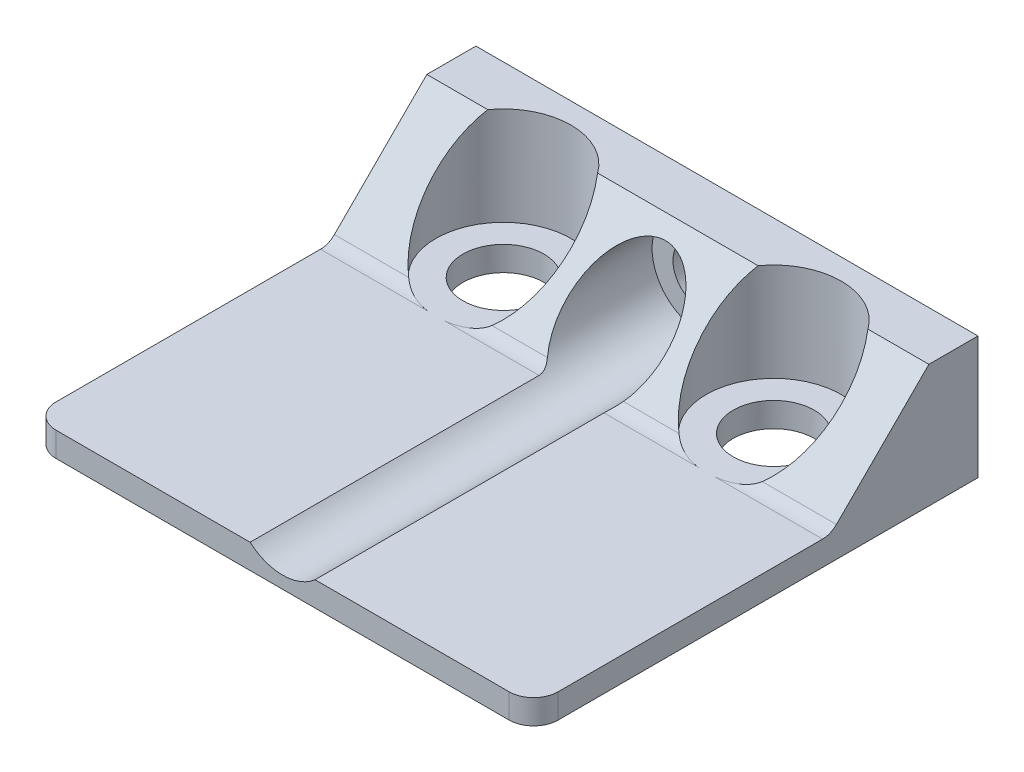
ISO-10303-21;
HEADER;
FILE_DESCRIPTION(('STEP AP214'),'2;1');
FILE_NAME('part.step','',(''),(''),'','','');
FILE_SCHEMA(('AUTOMOTIVE_DESIGN { 1 0 10303 214 1 1 1 1 }'));
ENDSEC;
DATA;
#1=APPLICATION_CONTEXT('core data for automotive mechanical design processes');
#2=APPLICATION_PROTOCOL_DEFINITION('international standard','automotive_design',2000,#1);
#3=PRODUCT_CONTEXT('',#1,'mechanical');
#4=PRODUCT('Part','Part','',(#3));
#5=PRODUCT_RELATED_PRODUCT_CATEGORY('part','',(#4));
#6=PRODUCT_DEFINITION_FORMATION('','',#4);
#7=PRODUCT_DEFINITION_CONTEXT('part definition',#1,'design');
#8=PRODUCT_DEFINITION('design','',#6,#7);
#9=PRODUCT_DEFINITION_SHAPE('','',#8);
#10=(LENGTH_UNIT() NAMED_UNIT(*) SI_UNIT(.MILLI.,.METRE.));
#11=(NAMED_UNIT(*) PLANE_ANGLE_UNIT() SI_UNIT($,.RADIAN.));
#12=(NAMED_UNIT(*) SI_UNIT($,.STERADIAN.) SOLID_ANGLE_UNIT());
#13=UNCERTAINTY_MEASURE_WITH_UNIT(LENGTH_MEASURE(1.E-05),#10,'distance_accuracy_value','');
#14=(GEOMETRIC_REPRESENTATION_CONTEXT(3) GLOBAL_UNCERTAINTY_ASSIGNED_CONTEXT((#13)) GLOBAL_UNIT_ASSIGNED_CONTEXT((#10,
#11,#12)) REPRESENTATION_CONTEXT('',''));
#15=CARTESIAN_POINT('',(0.,0.,0.));
#16=DIRECTION('',(0.,0.,1.));
#17=DIRECTION('',(1.,0.,0.));
#18=AXIS2_PLACEMENT_3D('',#15,#16,#17);
#19=CARTESIAN_POINT('',(0.,1.,0.));
#20=DIRECTION('',(0.,-1.,0.));
#21=DIRECTION('',(0.,0.,-1.));
#22=AXIS2_PLACEMENT_3D('',#19,#20,#21);
#23=PLANE('',#22);
#24=CARTESIAN_POINT('',(-5.505,1.,-5.45));
#25=DIRECTION('',(0.,1.,0.));
#26=DIRECTION('',(0.,0.,1.));
#27=AXIS2_PLACEMENT_3D('',#24,#25,#26);
#28=CIRCLE('',#27,1.65);
#29=CARTESIAN_POINT('',(-5.505,1.,-3.8));
#30=VERTEX_POINT('',#29);
#31=EDGE_CURVE('E220',#30,#30,#28,.F.);
#32=ORIENTED_EDGE('',*,*,#31,.T.);
#33=EDGE_LOOP('',(#32));
#34=FACE_BOUND('',#33,.T.);
#35=CARTESIAN_POINT('',(-5.505,1.,-5.45));
#36=DIRECTION('',(0.,1.,0.));
#37=DIRECTION('',(0.,0.,1.));
#38=AXIS2_PLACEMENT_3D('',#35,#36,#37);
#39=CIRCLE('',#38,2.75);
#40=CARTESIAN_POINT('',(-5.18544831353147,1.,-2.71862915010152));
#41=VERTEX_POINT('',#40);
#42=CARTESIAN_POINT('',(-5.82455168646852,1.,-2.71862915010152));
#43=VERTEX_POINT('',#42);
#44=EDGE_CURVE('E217',#41,#43,#39,.T.);
#45=ORIENTED_EDGE('',*,*,#44,.T.);
#46=DIRECTION('',(-1.,0.,0.));
#47=VECTOR('',#46,1.);
#48=CARTESIAN_POINT('',(-10.225,1.,-2.71862915010152));
#49=LINE('',#48,#47);
#50=CARTESIAN_POINT('',(-10.225,1.,-2.71862915010152));
#51=VERTEX_POINT('',#50);
#52=EDGE_CURVE('E334',#43,#51,#49,.T.);
#53=ORIENTED_EDGE('',*,*,#52,.T.);
#54=DIRECTION('',(0.,0.,1.));
#55=VECTOR('',#54,1.);
#56=CARTESIAN_POINT('',(-10.225,1.,9.05));
#57=LINE('',#56,#55);
#58=CARTESIAN_POINT('',(-10.225,1.,8.05));
#59=VERTEX_POINT('',#58);
#60=EDGE_CURVE('E277',#51,#59,#57,.T.);
#61=ORIENTED_EDGE('',*,*,#60,.T.);
#62=CARTESIAN_POINT('',(-9.225,1.,8.05));
#63=DIRECTION('',(0.,-1.,0.));
#64=DIRECTION('',(0.,0.,-1.));
#65=AXIS2_PLACEMENT_3D('',#62,#63,#64);
#66=CIRCLE('',#65,1.);
#67=CARTESIAN_POINT('',(-9.225,1.,9.05));
#68=VERTEX_POINT('',#67);
#69=EDGE_CURVE('E186',#59,#68,#66,.F.);
#70=ORIENTED_EDGE('',*,*,#69,.T.);
#71=DIRECTION('',(1.,0.,0.));
#72=VECTOR('',#71,1.);
#73=CARTESIAN_POINT('',(-10.225,1.,9.05));
#74=LINE('',#73,#72);
#75=CARTESIAN_POINT('',(-1.3228756555323,1.,9.05));
#76=VERTEX_POINT('',#75);
#77=EDGE_CURVE('E184',#68,#76,#74,.T.);
#78=ORIENTED_EDGE('',*,*,#77,.T.);
#79=DIRECTION('',(0.,0.,-1.));
#80=VECTOR('',#79,1.);
#81=CARTESIAN_POINT('',(-1.3228756555323,1.,14.7068542494924));
#82=LINE('',#81,#80);
#83=CARTESIAN_POINT('',(-1.3228756555323,1.,-2.71862915010152));
#84=VERTEX_POINT('',#83);
#85=EDGE_CURVE('E166',#84,#76,#82,.F.);
#86=ORIENTED_EDGE('',*,*,#85,.F.);
#87=DIRECTION('',(-1.,0.,0.));
#88=VECTOR('',#87,1.);
#89=CARTESIAN_POINT('',(-4.16242784179024,1.,-2.71862915010152));
#90=LINE('',#89,#88);
#91=EDGE_CURVE('E331',#84,#41,#90,.T.);
#92=ORIENTED_EDGE('',*,*,#91,.T.);
#93=EDGE_LOOP('',(#45,#53,#61,#70,#78,#86,#92));
#94=FACE_BOUND('',#93,.T.);
#95=ADVANCED_FACE('F42',(#34,#94),#23,.F.);
#96=CARTESIAN_POINT('',(5.505,1.,-5.45));
#97=DIRECTION('',(0.,1.,0.));
#98=DIRECTION('',(0.,0.,1.));
#99=AXIS2_PLACEMENT_3D('',#96,#97,#98);
#100=CIRCLE('',#99,1.65);
#101=CARTESIAN_POINT('',(5.505,1.,-3.8));
#102=VERTEX_POINT('',#101);
#103=EDGE_CURVE('E235',#102,#102,#100,.F.);
#104=ORIENTED_EDGE('',*,*,#103,.T.);
#105=EDGE_LOOP('',(#104));
#106=FACE_BOUND('',#105,.T.);
#107=CARTESIAN_POINT('',(5.505,1.,-5.45));
#108=DIRECTION('',(0.,1.,0.));
#109=DIRECTION('',(0.,0.,1.));
#110=AXIS2_PLACEMENT_3D('',#107,#108,#109);
#111=CIRCLE('',#110,2.75);
#112=CARTESIAN_POINT('',(5.82455168646852,1.,-2.71862915010152));
#113=VERTEX_POINT('',#112);
#114=CARTESIAN_POINT('',(5.18544831353149,1.,-2.71862915010152));
#115=VERTEX_POINT('',#114);
#116=EDGE_CURVE('E216',#113,#115,#111,.T.);
#117=ORIENTED_EDGE('',*,*,#116,.T.);
#118=DIRECTION('',(-1.,0.,0.));
#119=VECTOR('',#118,1.);
#120=CARTESIAN_POINT('',(1.3228756555323,1.,-2.71862915010152));
#121=LINE('',#120,#119);
#122=CARTESIAN_POINT('',(1.3228756555323,1.,-2.71862915010152));
#123=VERTEX_POINT('',#122);
#124=EDGE_CURVE('E351',#115,#123,#121,.T.);
#125=ORIENTED_EDGE('',*,*,#124,.T.);
#126=DIRECTION('',(0.,0.,-1.));
#127=VECTOR('',#126,1.);
#128=CARTESIAN_POINT('',(1.3228756555323,1.,14.7068542494924));
#129=LINE('',#128,#127);
#130=CARTESIAN_POINT('',(1.3228756555323,1.,9.05));
#131=VERTEX_POINT('',#130);
#132=EDGE_CURVE('E181',#131,#123,#129,.T.);
#133=ORIENTED_EDGE('',*,*,#132,.F.);
#134=CARTESIAN_POINT('',(9.225,1.,9.05));
#135=VERTEX_POINT('',#134);
#136=EDGE_CURVE('E192',#131,#135,#74,.T.);
#137=ORIENTED_EDGE('',*,*,#136,.T.);
#138=CARTESIAN_POINT('',(9.225,1.,8.05));
#139=DIRECTION('',(0.,-1.,0.));
#140=DIRECTION('',(0.,0.,-1.));
#141=AXIS2_PLACEMENT_3D('',#138,#139,#140);
#142=CIRCLE('',#141,1.);
#143=CARTESIAN_POINT('',(10.225,1.,8.05));
#144=VERTEX_POINT('',#143);
#145=EDGE_CURVE('E322',#135,#144,#142,.F.);
#146=ORIENTED_EDGE('',*,*,#145,.T.);
#147=DIRECTION('',(0.,0.,-1.));
#148=VECTOR('',#147,1.);
#149=CARTESIAN_POINT('',(10.225,1.,9.05));
#150=LINE('',#149,#148);
#151=CARTESIAN_POINT('',(10.225,1.,-2.71862915010152));
#152=VERTEX_POINT('',#151);
#153=EDGE_CURVE('E273',#144,#152,#150,.T.);
#154=ORIENTED_EDGE('',*,*,#153,.T.);
#155=DIRECTION('',(-1.,0.,0.));
#156=VECTOR('',#155,1.);
#157=CARTESIAN_POINT('',(6.84757215820976,1.,-2.71862915010152));
#158=LINE('',#157,#156);
#159=EDGE_CURVE('E347',#152,#113,#158,.T.);
#160=ORIENTED_EDGE('',*,*,#159,.T.);
#161=EDGE_LOOP('',(#117,#125,#133,#137,#146,#154,#160));
#162=FACE_BOUND('',#161,.T.);
#163=ADVANCED_FACE('F418',(#106,#162),#23,.F.);
#164=CARTESIAN_POINT('',(0.,2.5,-12.3026911934581));
#165=DIRECTION('',(0.,0.,1.));
#166=DIRECTION('',(1.,0.,0.));
#167=AXIS2_PLACEMENT_3D('',#164,#165,#166);
#168=CYLINDRICAL_SURFACE('',#167,1.15);
#169=CARTESIAN_POINT('',(0.,2.5,-9.05));
#170=DIRECTION('',(0.,0.,1.));
#171=DIRECTION('',(1.,0.,0.));
#172=AXIS2_PLACEMENT_3D('',#169,#170,#171);
#173=CIRCLE('',#172,1.15);
#174=CARTESIAN_POINT('',(1.15,2.5,-9.05));
#175=VERTEX_POINT('',#174);
#176=EDGE_CURVE('E212',#175,#175,#173,.F.);
#177=ORIENTED_EDGE('',*,*,#176,.T.);
#178=EDGE_LOOP('',(#177));
#179=FACE_BOUND('',#178,.T.);
#180=CARTESIAN_POINT('',(0.,2.5,-8.));
#181=DIRECTION('',(0.,0.,1.));
#182=DIRECTION('',(1.,0.,0.));
#183=AXIS2_PLACEMENT_3D('',#180,#181,#182);
#184=CIRCLE('',#183,1.15);
#185=CARTESIAN_POINT('',(1.15,2.5,-8.));
#186=VERTEX_POINT('',#185);
#187=EDGE_CURVE('E199',#186,#186,#184,.F.);
#188=ORIENTED_EDGE('',*,*,#187,.F.);
#189=EDGE_LOOP('',(#188));
#190=FACE_BOUND('',#189,.T.);
#191=ADVANCED_FACE('F414',(#179,#190),#168,.F.);
#192=CARTESIAN_POINT('',(17.436102550928,1.,-3.05));
#193=DIRECTION('',(0.,-0.707106781186548,-0.707106781186548));
#194=DIRECTION('',(0.,0.707106781186548,-0.707106781186548));
#195=AXIS2_PLACEMENT_3D('',#192,#193,#194);
#196=PLANE('',#195);
#197=CARTESIAN_POINT('',(-5.505,3.4,-5.45));
#198=DIRECTION('',(0.,-0.707106781186548,-0.707106781186548));
#199=DIRECTION('',(0.,0.707106781186548,-0.707106781186548));
#200=AXIS2_PLACEMENT_3D('',#197,#198,#199);
#201=ELLIPSE('',#200,3.88908729652601,2.75);
#202=CARTESIAN_POINT('',(-3.26837307536549,5.,-7.05));
#203=VERTEX_POINT('',#202);
#204=CARTESIAN_POINT('',(-3.81021191880446,1.23431457505076,-3.28431457505076));
#205=VERTEX_POINT('',#204);
#206=EDGE_CURVE('E239',#203,#205,#201,.T.);
#207=ORIENTED_EDGE('',*,*,#206,.T.);
#208=DIRECTION('',(-1.,0.,0.));
#209=VECTOR('',#208,1.);
#210=CARTESIAN_POINT('',(-1.32287565553229,1.23431457505076,-3.28431457505076));
#211=LINE('',#210,#209);
#212=CARTESIAN_POINT('',(-1.54856075278662,1.23431457505076,-3.28431457505076));
#213=VERTEX_POINT('',#212);
#214=EDGE_CURVE('E344',#205,#213,#211,.F.);
#215=ORIENTED_EDGE('',*,*,#214,.T.);
#216=CARTESIAN_POINT('',(0.,2.5,-4.55));
#217=DIRECTION('',(0.,-0.707106781186548,-0.707106781186548));
#218=DIRECTION('',(0.,0.707106781186548,-0.707106781186548));
#219=AXIS2_PLACEMENT_3D('',#216,#217,#218);
#220=ELLIPSE('',#219,2.82842712474619,2.);
#221=CARTESIAN_POINT('',(1.54856075278662,1.23431457505076,-3.28431457505076));
#222=VERTEX_POINT('',#221);
#223=EDGE_CURVE('E205',#222,#213,#220,.F.);
#224=ORIENTED_EDGE('',*,*,#223,.F.);
#225=DIRECTION('',(-1.,0.,0.));
#226=VECTOR('',#225,1.);
#227=CARTESIAN_POINT('',(4.16242784179025,1.23431457505076,-3.28431457505076));
#228=LINE('',#227,#226);
#229=CARTESIAN_POINT('',(3.81021191880447,1.23431457505076,-3.28431457505076));
#230=VERTEX_POINT('',#229);
#231=EDGE_CURVE('E341',#222,#230,#228,.F.);
#232=ORIENTED_EDGE('',*,*,#231,.T.);
#233=CARTESIAN_POINT('',(5.505,3.4,-5.45));
#234=DIRECTION('',(0.,-0.707106781186548,-0.707106781186548));
#235=DIRECTION('',(0.,0.707106781186548,-0.707106781186548));
#236=AXIS2_PLACEMENT_3D('',#233,#234,#235);
#237=ELLIPSE('',#236,3.88908729652601,2.75);
#238=CARTESIAN_POINT('',(3.2683730753655,5.,-7.05));
#239=VERTEX_POINT('',#238);
#240=EDGE_CURVE('E231',#230,#239,#237,.T.);
#241=ORIENTED_EDGE('',*,*,#240,.T.);
#242=DIRECTION('',(-1.,0.,0.));
#243=VECTOR('',#242,1.);
#244=CARTESIAN_POINT('',(17.436102550928,5.,-7.05));
#245=LINE('',#244,#243);
#246=EDGE_CURVE('E267',#239,#203,#245,.T.);
#247=ORIENTED_EDGE('',*,*,#246,.T.);
#248=EDGE_LOOP('',(#207,#215,#224,#232,#241,#247));
#249=FACE_BOUND('',#248,.T.);
#250=ADVANCED_FACE('F417',(#249),#196,.F.);
#251=CARTESIAN_POINT('',(7.74162692463451,5.,-7.05));
#252=VERTEX_POINT('',#251);
#253=CARTESIAN_POINT('',(7.19978808119554,1.23431457505076,-3.28431457505076));
#254=VERTEX_POINT('',#253);
#255=EDGE_CURVE('E234',#252,#254,#237,.T.);
#256=ORIENTED_EDGE('',*,*,#255,.T.);
#257=DIRECTION('',(-1.,0.,0.));
#258=VECTOR('',#257,1.);
#259=CARTESIAN_POINT('',(10.225,1.23431457505076,-3.28431457505076));
#260=LINE('',#259,#258);
#261=CARTESIAN_POINT('',(10.225,1.23431457505076,-3.28431457505076));
#262=VERTEX_POINT('',#261);
#263=EDGE_CURVE('E59',#254,#262,#260,.F.);
#264=ORIENTED_EDGE('',*,*,#263,.T.);
#265=DIRECTION('',(0.,0.707106781186548,-0.707106781186548));
#266=VECTOR('',#265,1.);
#267=CARTESIAN_POINT('',(10.225,1.,-3.05));
#268=LINE('',#267,#266);
#269=CARTESIAN_POINT('',(10.225,5.,-7.05));
#270=VERTEX_POINT('',#269);
#271=EDGE_CURVE('E261',#262,#270,#268,.T.);
#272=ORIENTED_EDGE('',*,*,#271,.T.);
#273=EDGE_CURVE('E262',#270,#252,#245,.T.);
#274=ORIENTED_EDGE('',*,*,#273,.T.);
#275=EDGE_LOOP('',(#256,#264,#272,#274));
#276=FACE_BOUND('',#275,.T.);
#277=ADVANCED_FACE('F425',(#276),#196,.F.);
#278=CARTESIAN_POINT('',(5.505,-4.66690475583121,-5.45));
#279=DIRECTION('',(0.,1.,0.));
#280=DIRECTION('',(0.,0.,1.));
#281=AXIS2_PLACEMENT_3D('',#278,#279,#280);
#282=CYLINDRICAL_SURFACE('',#281,1.65);
#283=CARTESIAN_POINT('',(5.505,0.,-5.45));
#284=DIRECTION('',(0.,-1.,0.));
#285=DIRECTION('',(0.,0.,-1.));
#286=AXIS2_PLACEMENT_3D('',#283,#284,#285);
#287=CIRCLE('',#286,1.65);
#288=CARTESIAN_POINT('',(5.505,0.,-7.1));
#289=VERTEX_POINT('',#288);
#290=EDGE_CURVE('E245',#289,#289,#287,.F.);
#291=ORIENTED_EDGE('',*,*,#290,.F.);
#292=EDGE_LOOP('',(#291));
#293=FACE_BOUND('',#292,.T.);
#294=ORIENTED_EDGE('',*,*,#103,.F.);
#295=EDGE_LOOP('',(#294));
#296=FACE_BOUND('',#295,.T.);
#297=ADVANCED_FACE('F528',(#293,#296),#282,.F.);
#298=CARTESIAN_POINT('',(-5.505,-4.66690475583121,-5.45));
#299=DIRECTION('',(0.,1.,0.));
#300=DIRECTION('',(0.,0.,1.));
#301=AXIS2_PLACEMENT_3D('',#298,#299,#300);
#302=CYLINDRICAL_SURFACE('',#301,1.65);
#303=CARTESIAN_POINT('',(-5.505,0.,-5.45));
#304=DIRECTION('',(0.,-1.,0.));
#305=DIRECTION('',(0.,0.,-1.));
#306=AXIS2_PLACEMENT_3D('',#303,#304,#305);
#307=CIRCLE('',#306,1.65);
#308=CARTESIAN_POINT('',(-5.505,0.,-7.1));
#309=VERTEX_POINT('',#308);
#310=EDGE_CURVE('E240',#309,#309,#307,.F.);
#311=ORIENTED_EDGE('',*,*,#310,.F.);
#312=EDGE_LOOP('',(#311));
#313=FACE_BOUND('',#312,.T.);
#314=ORIENTED_EDGE('',*,*,#31,.F.);
#315=EDGE_LOOP('',(#314));
#316=FACE_BOUND('',#315,.T.);
#317=ADVANCED_FACE('F456',(#313,#316),#302,.F.);
#318=CARTESIAN_POINT('',(10.225,1.,9.05));
#319=DIRECTION('',(-1.,0.,0.));
#320=DIRECTION('',(0.,0.,1.));
#321=AXIS2_PLACEMENT_3D('',#318,#319,#320);
#322=PLANE('',#321);
#323=ORIENTED_EDGE('',*,*,#153,.F.);
#324=DIRECTION('',(0.,-1.,0.));
#325=VECTOR('',#324,1.);
#326=CARTESIAN_POINT('',(10.225,1.,8.05));
#327=LINE('',#326,#325);
#328=CARTESIAN_POINT('',(10.225,0.,8.05));
#329=VERTEX_POINT('',#328);
#330=EDGE_CURVE('E180',#144,#329,#327,.T.);
#331=ORIENTED_EDGE('',*,*,#330,.T.);
#332=DIRECTION('',(0.,0.,-1.));
#333=VECTOR('',#332,1.);
#334=CARTESIAN_POINT('',(10.225,0.,9.05));
#335=LINE('',#334,#333);
#336=CARTESIAN_POINT('',(10.225,0.,-9.05));
#337=VERTEX_POINT('',#336);
#338=EDGE_CURVE('E260',#329,#337,#335,.T.);
#339=ORIENTED_EDGE('',*,*,#338,.T.);
#340=DIRECTION('',(0.,-1.,0.));
#341=VECTOR('',#340,1.);
#342=CARTESIAN_POINT('',(10.225,1.,-9.05));
#343=LINE('',#342,#341);
#344=CARTESIAN_POINT('',(10.225,5.,-9.05));
#345=VERTEX_POINT('',#344);
#346=EDGE_CURVE('E295',#345,#337,#343,.T.);
#347=ORIENTED_EDGE('',*,*,#346,.F.);
#348=DIRECTION('',(0.,0.,-1.));
#349=VECTOR('',#348,1.);
#350=CARTESIAN_POINT('',(10.225,5.,-9.05));
#351=LINE('',#350,#349);
#352=EDGE_CURVE('E256',#270,#345,#351,.T.);
#353=ORIENTED_EDGE('',*,*,#352,.F.);
#354=ORIENTED_EDGE('',*,*,#271,.F.);
#355=CARTESIAN_POINT('',(10.225,1.8,-2.71862915010152));
#356=DIRECTION('',(-1.,0.,0.));
#357=DIRECTION('',(0.,0.,1.));
#358=AXIS2_PLACEMENT_3D('',#355,#356,#357);
#359=CIRCLE('',#358,0.8);
#360=EDGE_CURVE('E11',#262,#152,#359,.T.);
#361=ORIENTED_EDGE('',*,*,#360,.T.);
#362=EDGE_LOOP('',(#323,#331,#339,#347,#353,#354,#361));
#363=FACE_BOUND('',#362,.T.);
#364=ADVANCED_FACE('F453',(#363),#322,.F.);
#365=CARTESIAN_POINT('',(-10.225,1.,-9.05));
#366=DIRECTION('',(0.,0.,1.));
#367=DIRECTION('',(1.,0.,0.));
#368=AXIS2_PLACEMENT_3D('',#365,#366,#367);
#369=PLANE('',#368);
#370=ORIENTED_EDGE('',*,*,#176,.F.);
#371=EDGE_LOOP('',(#370));
#372=FACE_BOUND('',#371,.T.);
#373=DIRECTION('',(-1.,0.,0.));
#374=VECTOR('',#373,1.);
#375=CARTESIAN_POINT('',(-10.225,0.,-9.05));
#376=LINE('',#375,#374);
#377=CARTESIAN_POINT('',(-10.225,0.,-9.05));
#378=VERTEX_POINT('',#377);
#379=EDGE_CURVE('E283',#337,#378,#376,.T.);
#380=ORIENTED_EDGE('',*,*,#379,.T.);
#381=DIRECTION('',(0.,-1.,0.));
#382=VECTOR('',#381,1.);
#383=CARTESIAN_POINT('',(-10.225,1.,-9.05));
#384=LINE('',#383,#382);
#385=CARTESIAN_POINT('',(-10.225,5.,-9.05));
#386=VERTEX_POINT('',#385);
#387=EDGE_CURVE('E191',#386,#378,#384,.T.);
#388=ORIENTED_EDGE('',*,*,#387,.F.);
#389=DIRECTION('',(-1.,0.,0.));
#390=VECTOR('',#389,1.);
#391=CARTESIAN_POINT('',(17.436102550928,5.,-9.05));
#392=LINE('',#391,#390);
#393=EDGE_CURVE('E266',#345,#386,#392,.T.);
#394=ORIENTED_EDGE('',*,*,#393,.F.);
#395=ORIENTED_EDGE('',*,*,#346,.T.);
#396=EDGE_LOOP('',(#380,#388,#394,#395));
#397=FACE_BOUND('',#396,.T.);
#398=ADVANCED_FACE('F449',(#372,#397),#369,.F.);
#399=CARTESIAN_POINT('',(-10.225,1.,9.05));
#400=DIRECTION('',(1.,0.,0.));
#401=DIRECTION('',(0.,0.,-1.));
#402=AXIS2_PLACEMENT_3D('',#399,#400,#401);
#403=PLANE('',#402);
#404=DIRECTION('',(0.,0.,1.));
#405=VECTOR('',#404,1.);
#406=CARTESIAN_POINT('',(-10.225,0.,9.05));
#407=LINE('',#406,#405);
#408=CARTESIAN_POINT('',(-10.225,0.,8.05));
#409=VERTEX_POINT('',#408);
#410=EDGE_CURVE('E286',#378,#409,#407,.T.);
#411=ORIENTED_EDGE('',*,*,#410,.T.);
#412=DIRECTION('',(0.,-1.,0.));
#413=VECTOR('',#412,1.);
#414=CARTESIAN_POINT('',(-10.225,1.,8.05));
#415=LINE('',#414,#413);
#416=EDGE_CURVE('E325',#409,#59,#415,.F.);
#417=ORIENTED_EDGE('',*,*,#416,.T.);
#418=ORIENTED_EDGE('',*,*,#60,.F.);
#419=CARTESIAN_POINT('',(-10.225,1.8,-2.71862915010152));
#420=DIRECTION('',(1.,0.,0.));
#421=DIRECTION('',(0.,0.,-1.));
#422=AXIS2_PLACEMENT_3D('',#419,#420,#421);
#423=CIRCLE('',#422,0.8);
#424=CARTESIAN_POINT('',(-10.225,1.23431457505076,-3.28431457505076));
#425=VERTEX_POINT('',#424);
#426=EDGE_CURVE('E357',#51,#425,#423,.T.);
#427=ORIENTED_EDGE('',*,*,#426,.T.);
#428=DIRECTION('',(0.,0.707106781186548,-0.707106781186548));
#429=VECTOR('',#428,1.);
#430=CARTESIAN_POINT('',(-10.225,1.,-3.05));
#431=LINE('',#430,#429);
#432=CARTESIAN_POINT('',(-10.225,5.,-7.05));
#433=VERTEX_POINT('',#432);
#434=EDGE_CURVE('E252',#425,#433,#431,.T.);
#435=ORIENTED_EDGE('',*,*,#434,.T.);
#436=DIRECTION('',(0.,0.,-1.));
#437=VECTOR('',#436,1.);
#438=CARTESIAN_POINT('',(-10.225,5.,-9.05));
#439=LINE('',#438,#437);
#440=EDGE_CURVE('E244',#433,#386,#439,.T.);
#441=ORIENTED_EDGE('',*,*,#440,.T.);
#442=ORIENTED_EDGE('',*,*,#387,.T.);
#443=EDGE_LOOP('',(#411,#417,#418,#427,#435,#441,#442));
#444=FACE_BOUND('',#443,.T.);
#445=ADVANCED_FACE('F446',(#444),#403,.F.);
#446=CARTESIAN_POINT('',(-10.225,1.,9.05));
#447=DIRECTION('',(0.,0.,-1.));
#448=DIRECTION('',(-1.,0.,0.));
#449=AXIS2_PLACEMENT_3D('',#446,#447,#448);
#450=PLANE('',#449);
#451=DIRECTION('',(1.,0.,0.));
#452=VECTOR('',#451,1.);
#453=CARTESIAN_POINT('',(-10.225,0.,9.05));
#454=LINE('',#453,#452);
#455=CARTESIAN_POINT('',(-9.225,0.,9.05));
#456=VERTEX_POINT('',#455);
#457=CARTESIAN_POINT('',(9.225,0.,9.05));
#458=VERTEX_POINT('',#457);
#459=EDGE_CURVE('E278',#456,#458,#454,.T.);
#460=ORIENTED_EDGE('',*,*,#459,.T.);
#461=DIRECTION('',(0.,-1.,0.));
#462=VECTOR('',#461,1.);
#463=CARTESIAN_POINT('',(9.225,1.,9.05));
#464=LINE('',#463,#462);
#465=EDGE_CURVE('E319',#458,#135,#464,.F.);
#466=ORIENTED_EDGE('',*,*,#465,.T.);
#467=ORIENTED_EDGE('',*,*,#136,.F.);
#468=CARTESIAN_POINT('',(0.,2.5,9.05));
#469=DIRECTION('',(0.,0.,-1.));
#470=DIRECTION('',(-1.,0.,0.));
#471=AXIS2_PLACEMENT_3D('',#468,#469,#470);
#472=CIRCLE('',#471,2.);
#473=EDGE_CURVE('E172',#131,#76,#472,.T.);
#474=ORIENTED_EDGE('',*,*,#473,.T.);
#475=ORIENTED_EDGE('',*,*,#77,.F.);
#476=DIRECTION('',(0.,-1.,0.));
#477=VECTOR('',#476,1.);
#478=CARTESIAN_POINT('',(-9.225,1.,9.05));
#479=LINE('',#478,#477);
#480=EDGE_CURVE('E316',#68,#456,#479,.T.);
#481=ORIENTED_EDGE('',*,*,#480,.T.);
#482=EDGE_LOOP('',(#460,#466,#467,#474,#475,#481));
#483=FACE_BOUND('',#482,.T.);
#484=ADVANCED_FACE('F196',(#483),#450,.F.);
#485=CARTESIAN_POINT('',(0.,0.,0.));
#486=DIRECTION('',(0.,-1.,0.));
#487=DIRECTION('',(0.,0.,-1.));
#488=AXIS2_PLACEMENT_3D('',#485,#486,#487);
#489=PLANE('',#488);
#490=ORIENTED_EDGE('',*,*,#310,.T.);
#491=EDGE_LOOP('',(#490));
#492=FACE_BOUND('',#491,.T.);
#493=ORIENTED_EDGE('',*,*,#290,.T.);
#494=EDGE_LOOP('',(#493));
#495=FACE_BOUND('',#494,.T.);
#496=ORIENTED_EDGE('',*,*,#338,.F.);
#497=CARTESIAN_POINT('',(9.225,0.,8.05));
#498=DIRECTION('',(0.,-1.,0.));
#499=DIRECTION('',(0.,0.,-1.));
#500=AXIS2_PLACEMENT_3D('',#497,#498,#499);
#501=CIRCLE('',#500,1.);
#502=EDGE_CURVE('E313',#329,#458,#501,.T.);
#503=ORIENTED_EDGE('',*,*,#502,.T.);
#504=ORIENTED_EDGE('',*,*,#459,.F.);
#505=CARTESIAN_POINT('',(-9.225,0.,8.05));
#506=DIRECTION('',(0.,-1.,0.));
#507=DIRECTION('',(0.,0.,-1.));
#508=AXIS2_PLACEMENT_3D('',#505,#506,#507);
#509=CIRCLE('',#508,1.);
#510=EDGE_CURVE('E310',#456,#409,#509,.T.);
#511=ORIENTED_EDGE('',*,*,#510,.T.);
#512=ORIENTED_EDGE('',*,*,#410,.F.);
#513=ORIENTED_EDGE('',*,*,#379,.F.);
#514=EDGE_LOOP('',(#496,#503,#504,#511,#512,#513));
#515=FACE_BOUND('',#514,.T.);
#516=ADVANCED_FACE('F440',(#492,#495,#515),#489,.T.);
#517=ORIENTED_EDGE('',*,*,#434,.F.);
#518=DIRECTION('',(-1.,0.,0.));
#519=VECTOR('',#518,1.);
#520=CARTESIAN_POINT('',(-6.84757215820975,1.23431457505076,-3.28431457505076));
#521=LINE('',#520,#519);
#522=CARTESIAN_POINT('',(-7.19978808119553,1.23431457505076,-3.28431457505076));
#523=VERTEX_POINT('',#522);
#524=EDGE_CURVE('E338',#425,#523,#521,.F.);
#525=ORIENTED_EDGE('',*,*,#524,.T.);
#526=CARTESIAN_POINT('',(-7.7416269246345,5.,-7.05));
#527=VERTEX_POINT('',#526);
#528=EDGE_CURVE('E236',#523,#527,#201,.T.);
#529=ORIENTED_EDGE('',*,*,#528,.T.);
#530=EDGE_CURVE('E255',#527,#433,#245,.T.);
#531=ORIENTED_EDGE('',*,*,#530,.T.);
#532=EDGE_LOOP('',(#517,#525,#529,#531));
#533=FACE_BOUND('',#532,.T.);
#534=ADVANCED_FACE('F428',(#533),#196,.F.);
#535=CARTESIAN_POINT('',(17.436102550928,5.,-9.05));
#536=DIRECTION('',(0.,-1.,0.));
#537=DIRECTION('',(0.,0.,-1.));
#538=AXIS2_PLACEMENT_3D('',#535,#536,#537);
#539=PLANE('',#538);
#540=ORIENTED_EDGE('',*,*,#530,.F.);
#541=CARTESIAN_POINT('',(-5.505,5.,-5.45));
#542=DIRECTION('',(0.,1.,0.));
#543=DIRECTION('',(0.,0.,1.));
#544=AXIS2_PLACEMENT_3D('',#541,#542,#543);
#545=CIRCLE('',#544,2.75);
#546=EDGE_CURVE('E221',#203,#527,#545,.T.);
#547=ORIENTED_EDGE('',*,*,#546,.F.);
#548=ORIENTED_EDGE('',*,*,#246,.F.);
#549=CARTESIAN_POINT('',(5.505,5.,-5.45));
#550=DIRECTION('',(0.,1.,0.));
#551=DIRECTION('',(0.,0.,1.));
#552=AXIS2_PLACEMENT_3D('',#549,#550,#551);
#553=CIRCLE('',#552,2.75);
#554=EDGE_CURVE('E225',#252,#239,#553,.T.);
#555=ORIENTED_EDGE('',*,*,#554,.F.);
#556=ORIENTED_EDGE('',*,*,#273,.F.);
#557=ORIENTED_EDGE('',*,*,#352,.T.);
#558=ORIENTED_EDGE('',*,*,#393,.T.);
#559=ORIENTED_EDGE('',*,*,#440,.F.);
#560=EDGE_LOOP('',(#540,#547,#548,#555,#556,#557,#558,#559));
#561=FACE_BOUND('',#560,.T.);
#562=ADVANCED_FACE('F439',(#561),#539,.F.);
#563=CARTESIAN_POINT('',(-5.505,1.,-5.45));
#564=DIRECTION('',(0.,1.,0.));
#565=DIRECTION('',(0.,0.,1.));
#566=AXIS2_PLACEMENT_3D('',#563,#564,#565);
#567=CYLINDRICAL_SURFACE('',#566,2.75);
#568=ORIENTED_EDGE('',*,*,#546,.T.);
#569=ORIENTED_EDGE('',*,*,#528,.F.);
#570=CARTESIAN_POINT('',(-7.19978808119553,1.23431457505076,-3.28431457505076));
#571=CARTESIAN_POINT('',(-7.17676303595612,1.21629866020412,-3.26628737860387));
#572=CARTESIAN_POINT('',(-7.1527478575461,1.19981513301786,-3.24809548288279));
#573=CARTESIAN_POINT('',(-7.10307382886715,1.1696405452755,-3.21178721852033));
#574=CARTESIAN_POINT('',(-7.07741917226694,1.15594270745398,-3.19367077421147));
#575=CARTESIAN_POINT('',(-6.99899285207995,1.11881922519449,-3.14036071956716));
#576=CARTESIAN_POINT('',(-6.94415851209485,1.09892191109369,-3.10572961383353));
#577=CARTESIAN_POINT('',(-6.84296518364584,1.06987366992461,-3.04687383008176));
#578=CARTESIAN_POINT('',(-6.79733748768969,1.05932934248543,-3.02201819650527));
#579=CARTESIAN_POINT('',(-6.70419944989193,1.04166673729903,-2.9746927353614));
#580=CARTESIAN_POINT('',(-6.65668834937617,1.03454985569223,-2.95222388292845));
#581=CARTESIAN_POINT('',(-6.55979759795412,1.0228573591216,-2.90977849892572));
#582=CARTESIAN_POINT('',(-6.51040564779421,1.01830348333384,-2.88982437003784));
#583=CARTESIAN_POINT('',(-6.4104191467199,1.01110271264249,-2.85277816553565));
#584=CARTESIAN_POINT('',(-6.3598242219814,1.00845641873612,-2.83568699321687));
#585=CARTESIAN_POINT('',(-6.22937061068227,1.00335354727814,-2.79582039306949));
#586=CARTESIAN_POINT('',(-6.14882367918793,1.00181373666932,-2.77513920971511));
#587=CARTESIAN_POINT('',(-6.02735566406739,1.0005631209713,-2.74975314882645));
#588=CARTESIAN_POINT('',(-5.98699489248629,1.00032116326347,-2.74225797905485));
#589=CARTESIAN_POINT('',(-5.90597818045944,1.00004184813011,-2.72908117756026));
#590=CARTESIAN_POINT('',(-5.86532224445951,1.00000448762928,-2.72339951857967));
#591=CARTESIAN_POINT('',(-5.82455168646852,1.,-2.71862915010152));
#592=B_SPLINE_CURVE_WITH_KNOTS('',3,(#570,#571,#572,#573,#574,#575,#576,#577,#578,#579,#580,
#581,#582,#583,#584,#585,#586,#587,#588,#589,#590,#591),.UNSPECIFIED.,.F.,.F.,(4,2,2,2,2,2,2,2,
2,2,4),(0.,0.102909240663611,0.205565038062098,0.408258442839869,0.567121915613927,
0.726050045430331,0.886306622697522,1.04661366789747,1.29570380910403,1.41882527983434,
1.54194489992424),.UNSPECIFIED.);
#593=EDGE_CURVE('E360',#523,#43,#592,.T.);
#594=ORIENTED_EDGE('',*,*,#593,.T.);
#595=ORIENTED_EDGE('',*,*,#44,.F.);
#596=CARTESIAN_POINT('',(-5.18544831353147,1.,-2.71862915010152));
#597=CARTESIAN_POINT('',(-5.11898294209104,1.00004581624285,-2.72639963919234));
#598=CARTESIAN_POINT('',(-5.05279649875277,1.00011483876901,-2.73660763521537));
#599=CARTESIAN_POINT('',(-4.92123564588077,1.00105560057543,-2.76183975563845));
#600=CARTESIAN_POINT('',(-4.85586285255883,1.00192873859601,-2.77687224243402));
#601=CARTESIAN_POINT('',(-4.72502050643681,1.0052748839496,-2.8120423932602));
#602=CARTESIAN_POINT('',(-4.65957933058103,1.00778202196276,-2.8322832610072));
#603=CARTESIAN_POINT('',(-4.53058773468968,1.01560048945947,-2.87751365077386));
#604=CARTESIAN_POINT('',(-4.46703557065711,1.02090914182043,-2.90249862476572));
#605=CARTESIAN_POINT('',(-4.33023050077817,1.03724021429423,-2.96222768451728));
#606=CARTESIAN_POINT('',(-4.25749102954836,1.04917216993184,-2.99792471739851));
#607=CARTESIAN_POINT('',(-4.11764580714379,1.08221324579011,-3.07429136070639));
#608=CARTESIAN_POINT('',(-4.05048941333465,1.10322581711918,-3.11490550700271));
#609=CARTESIAN_POINT('',(-3.95556607034215,1.14437966070314,-3.17773458456316));
#610=CARTESIAN_POINT('',(-3.9249966804709,1.15962896962367,-3.19891321304405));
#611=CARTESIAN_POINT('',(-3.86588820115149,1.19395954061648,-3.24156907968642));
#612=CARTESIAN_POINT('',(-3.83736679372796,1.21306974385453,-3.26304735867447));
#613=CARTESIAN_POINT('',(-3.81021191880446,1.23431457505076,-3.28431457505076));
#614=B_SPLINE_CURVE_WITH_KNOTS('',3,(#596,#597,#598,#599,#600,#601,#602,#603,#604,#605,#606,
#607,#608,#609,#610,#611,#612,#613),.UNSPECIFIED.,.F.,.F.,(4,2,2,2,2,2,2,2,4),(0.,
0.200719519185519,0.401788846145686,0.607198808851418,0.812412836622915,1.05748675842627,
1.30001670054188,1.42038837755598,1.5416982737546),.UNSPECIFIED.);
#615=EDGE_CURVE('E370',#41,#205,#614,.T.);
#616=ORIENTED_EDGE('',*,*,#615,.T.);
#617=ORIENTED_EDGE('',*,*,#206,.F.);
#618=EDGE_LOOP('',(#568,#569,#594,#595,#616,#617));
#619=FACE_BOUND('',#618,.T.);
#620=ADVANCED_FACE('F377',(#619),#567,.F.);
#621=CARTESIAN_POINT('',(5.505,1.,-5.45));
#622=DIRECTION('',(0.,1.,0.));
#623=DIRECTION('',(0.,0.,1.));
#624=AXIS2_PLACEMENT_3D('',#621,#622,#623);
#625=CYLINDRICAL_SURFACE('',#624,2.75);
#626=ORIENTED_EDGE('',*,*,#554,.T.);
#627=ORIENTED_EDGE('',*,*,#240,.F.);
#628=CARTESIAN_POINT('',(3.81021191880447,1.23431457505076,-3.28431457505076));
#629=CARTESIAN_POINT('',(3.83323696404389,1.21629866020412,-3.26628737860387));
#630=CARTESIAN_POINT('',(3.8572521424539,1.19981513301786,-3.24809548288279));
#631=CARTESIAN_POINT('',(3.90692617113285,1.1696405452755,-3.21178721852033));
#632=CARTESIAN_POINT('',(3.93258082773306,1.15594270745398,-3.19367077421147));
#633=CARTESIAN_POINT('',(4.01100714792005,1.11881922519449,-3.14036071956716));
#634=CARTESIAN_POINT('',(4.06584148790515,1.09892191109369,-3.10572961383353));
#635=CARTESIAN_POINT('',(4.16703481635416,1.06987366992461,-3.04687383008176));
#636=CARTESIAN_POINT('',(4.21266251231032,1.05932934248543,-3.02201819650527));
#637=CARTESIAN_POINT('',(4.30580055010808,1.04166673729903,-2.9746927353614));
#638=CARTESIAN_POINT('',(4.35331165062384,1.03454985569223,-2.95222388292845));
#639=CARTESIAN_POINT('',(4.45020240204588,1.0228573591216,-2.90977849892572));
#640=CARTESIAN_POINT('',(4.49959435220579,1.01830348333384,-2.88982437003784));
#641=CARTESIAN_POINT('',(4.5995808532801,1.01110271264249,-2.85277816553565));
#642=CARTESIAN_POINT('',(4.6501757780186,1.00845641873612,-2.83568699321687));
#643=CARTESIAN_POINT('',(4.78062938931773,1.00335354727814,-2.7958203930695));
#644=CARTESIAN_POINT('',(4.86117632081207,1.00181373666932,-2.77513920971511));
#645=CARTESIAN_POINT('',(4.98264433593261,1.0005631209713,-2.74975314882645));
#646=CARTESIAN_POINT('',(5.02300510751371,1.00032116326347,-2.74225797905485));
#647=CARTESIAN_POINT('',(5.10402181954056,1.00004184813011,-2.72908117756026));
#648=CARTESIAN_POINT('',(5.1446777555405,1.00000448762928,-2.72339951857967));
#649=CARTESIAN_POINT('',(5.18544831353149,1.,-2.71862915010152));
#650=B_SPLINE_CURVE_WITH_KNOTS('',3,(#628,#629,#630,#631,#632,#633,#634,#635,#636,#637,#638,
#639,#640,#641,#642,#643,#644,#645,#646,#647,#648,#649),.UNSPECIFIED.,.F.,.F.,(4,2,2,2,2,2,2,2,
2,2,4),(0.,0.102909240663611,0.205565038062098,0.408258442839869,0.567121915613927,
0.726050045430331,0.886306622697522,1.04661366789747,1.29570380910403,1.41882527983435,
1.54194489992424),.UNSPECIFIED.);
#651=EDGE_CURVE('E481',#230,#115,#650,.T.);
#652=ORIENTED_EDGE('',*,*,#651,.T.);
#653=ORIENTED_EDGE('',*,*,#116,.F.);
#654=CARTESIAN_POINT('',(5.82455168646852,1.,-2.71862915010152));
#655=CARTESIAN_POINT('',(5.89101705790895,1.00004581624285,-2.72639963919234));
#656=CARTESIAN_POINT('',(5.95720350124722,1.00011483876901,-2.73660763521537));
#657=CARTESIAN_POINT('',(6.08876435411923,1.00105560057543,-2.76183975563845));
#658=CARTESIAN_POINT('',(6.15413714744117,1.00192873859601,-2.77687224243402));
#659=CARTESIAN_POINT('',(6.28497949356318,1.0052748839496,-2.8120423932602));
#660=CARTESIAN_POINT('',(6.35042066941897,1.00778202196276,-2.8322832610072));
#661=CARTESIAN_POINT('',(6.47941226531031,1.01560048945947,-2.87751365077386));
#662=CARTESIAN_POINT('',(6.54296442934288,1.02090914182043,-2.90249862476571));
#663=CARTESIAN_POINT('',(6.67976949922183,1.03724021429423,-2.96222768451728));
#664=CARTESIAN_POINT('',(6.75250897045164,1.04917216993184,-2.99792471739851));
#665=CARTESIAN_POINT('',(6.89235419285621,1.0822132457901,-3.07429136070639));
#666=CARTESIAN_POINT('',(6.95951058666535,1.10322581711917,-3.11490550700271));
#667=CARTESIAN_POINT('',(7.05443392965784,1.14437966070314,-3.17773458456316));
#668=CARTESIAN_POINT('',(7.0850033195291,1.15962896962366,-3.19891321304405));
#669=CARTESIAN_POINT('',(7.14411179884851,1.19395954061648,-3.24156907968642));
#670=CARTESIAN_POINT('',(7.17263320627203,1.21306974385453,-3.26304735867446));
#671=CARTESIAN_POINT('',(7.19978808119554,1.23431457505076,-3.28431457505076));
#672=B_SPLINE_CURVE_WITH_KNOTS('',3,(#654,#655,#656,#657,#658,#659,#660,#661,#662,#663,#664,
#665,#666,#667,#668,#669,#670,#671),.UNSPECIFIED.,.F.,.F.,(4,2,2,2,2,2,2,2,4),(0.,
0.200719519185518,0.401788846145684,0.607198808851417,0.812412836622915,1.05748675842627,
1.30001670054188,1.42038837755598,1.54169827375461),.UNSPECIFIED.);
#673=EDGE_CURVE('E52',#113,#254,#672,.T.);
#674=ORIENTED_EDGE('',*,*,#673,.T.);
#675=ORIENTED_EDGE('',*,*,#255,.F.);
#676=EDGE_LOOP('',(#626,#627,#652,#653,#674,#675));
#677=FACE_BOUND('',#676,.T.);
#678=ADVANCED_FACE('F412',(#677),#625,.F.);
#679=CARTESIAN_POINT('',(0.,2.5,14.7068542494924));
#680=DIRECTION('',(0.,0.,-1.));
#681=DIRECTION('',(-1.,0.,0.));
#682=AXIS2_PLACEMENT_3D('',#679,#680,#681);
#683=CYLINDRICAL_SURFACE('',#682,2.);
#684=CARTESIAN_POINT('',(0.,2.5,-8.));
#685=DIRECTION('',(0.,0.,1.));
#686=DIRECTION('',(1.,0.,0.));
#687=AXIS2_PLACEMENT_3D('',#684,#685,#686);
#688=CIRCLE('',#687,2.);
#689=CARTESIAN_POINT('',(2.,2.5,-8.));
#690=VERTEX_POINT('',#689);
#691=EDGE_CURVE('E200',#690,#690,#688,.T.);
#692=ORIENTED_EDGE('',*,*,#691,.F.);
#693=EDGE_LOOP('',(#692));
#694=FACE_BOUND('',#693,.T.);
#695=ORIENTED_EDGE('',*,*,#223,.T.);
#696=CARTESIAN_POINT('',(-1.54856075278662,1.23431457505076,-3.28431457505076));
#697=CARTESIAN_POINT('',(-1.53619611517406,1.21918545546014,-3.26917833512828));
#698=CARTESIAN_POINT('',(-1.52392621564635,1.20462765649812,-3.25341293058531));
#699=CARTESIAN_POINT('',(-1.49972734647248,1.17668581379975,-3.22057250430348));
#700=CARTESIAN_POINT('',(-1.4877989723741,1.16330374513962,-3.20349536590783));
#701=CARTESIAN_POINT('',(-1.45247627633375,1.12466942752612,-3.14978169988693));
#702=CARTESIAN_POINT('',(-1.42991468775599,1.1013733744798,-3.11110165742299));
#703=CARTESIAN_POINT('',(-1.39486925365577,1.06655080894635,-3.03982194673127));
#704=CARTESIAN_POINT('',(-1.38131870994576,1.05354875387821,-3.00846527529508));
#705=CARTESIAN_POINT('',(-1.35780967929788,1.03145970416102,-2.94338098635534));
#706=CARTESIAN_POINT('',(-1.34782213284601,1.02234091362767,-2.90967536164878));
#707=CARTESIAN_POINT('',(-1.33460675601684,1.01040779537382,-2.84979054575745));
#708=CARTESIAN_POINT('',(-1.33027867761222,1.00655276746619,-2.82406212878871));
#709=CARTESIAN_POINT('',(-1.32437974829276,1.00132617369302,-2.77178612519302));
#710=CARTESIAN_POINT('',(-1.32283691743136,0.999979841430378,-2.74523291810837));
#711=CARTESIAN_POINT('',(-1.3228756555323,1.,-2.71862915010152));
#712=B_SPLINE_CURVE_WITH_KNOTS('',3,(#696,#697,#698,#699,#700,#701,#702,#703,#704,#705,#706,
#707,#708,#709,#710,#711),.UNSPECIFIED.,.F.,.F.,(4,2,2,2,2,2,2,4),(0.,0.0741062263521012,
0.148334651946644,0.298949472629423,0.408245295249849,0.516628152959675,0.595487939985385,
0.675136740022936),.UNSPECIFIED.);
#713=EDGE_CURVE('E175',#213,#84,#712,.T.);
#714=ORIENTED_EDGE('',*,*,#713,.T.);
#715=ORIENTED_EDGE('',*,*,#85,.T.);
#716=ORIENTED_EDGE('',*,*,#473,.F.);
#717=ORIENTED_EDGE('',*,*,#132,.T.);
#718=CARTESIAN_POINT('',(1.3228756555323,1.,-2.71862915010152));
#719=CARTESIAN_POINT('',(1.32286818019567,0.999996434694725,-2.7368439011061));
#720=CARTESIAN_POINT('',(1.32358172535562,1.00062251826659,-2.75504440888768));
#721=CARTESIAN_POINT('',(1.32637958281664,1.00309560738491,-2.79122848575431));
#722=CARTESIAN_POINT('',(1.32846175921892,1.00494071054089,-2.80921234847687));
#723=CARTESIAN_POINT('',(1.33657342815543,1.01217461918773,-2.86209018676052));
#724=CARTESIAN_POINT('',(1.34447278819622,1.01926479255986,-2.89648404073249));
#725=CARTESIAN_POINT('',(1.36414864775473,1.03737488766545,-2.96272080950398));
#726=CARTESIAN_POINT('',(1.37590103649608,1.04837040603123,-2.99457809436525));
#727=CARTESIAN_POINT('',(1.40224717498798,1.07380184691214,-3.05588913355316));
#728=CARTESIAN_POINT('',(1.41685981703513,1.08826079623324,-3.0853249496104));
#729=CARTESIAN_POINT('',(1.45016767537657,1.12244493175701,-3.145586133762));
#730=CARTESIAN_POINT('',(1.46914749248235,1.14263062036321,-3.17598803201914));
#731=CARTESIAN_POINT('',(1.50822888724787,1.18618433564668,-3.23291271600376));
#732=CARTESIAN_POINT('',(1.52831472780045,1.20951233223275,-3.25947675467879));
#733=CARTESIAN_POINT('',(1.54856075278662,1.23431457505076,-3.28431457505076));
#734=B_SPLINE_CURVE_WITH_KNOTS('',3,(#718,#719,#720,#721,#722,#723,#724,#725,#726,#727,#728,
#729,#730,#731,#732,#733),.UNSPECIFIED.,.F.,.F.,(4,2,2,2,2,2,2,4),(0.,0.0545937496460642,
0.109102501414866,0.216429854520465,0.323098019525608,0.430496082479847,0.553557716760598,
0.675178401387578),.UNSPECIFIED.);
#735=EDGE_CURVE('E402',#123,#222,#734,.T.);
#736=ORIENTED_EDGE('',*,*,#735,.T.);
#737=EDGE_LOOP('',(#695,#714,#715,#716,#717,#736));
#738=FACE_BOUND('',#737,.T.);
#739=ADVANCED_FACE('F169',(#694,#738),#683,.F.);
#740=CARTESIAN_POINT('',(0.,2.5,-8.));
#741=DIRECTION('',(0.,0.,1.));
#742=DIRECTION('',(1.,0.,0.));
#743=AXIS2_PLACEMENT_3D('',#740,#741,#742);
#744=PLANE('',#743);
#745=ORIENTED_EDGE('',*,*,#691,.T.);
#746=EDGE_LOOP('',(#745));
#747=FACE_BOUND('',#746,.T.);
#748=ORIENTED_EDGE('',*,*,#187,.T.);
#749=EDGE_LOOP('',(#748));
#750=FACE_BOUND('',#749,.T.);
#751=ADVANCED_FACE('F411',(#747,#750),#744,.T.);
#752=CARTESIAN_POINT('',(9.225,1.,8.05));
#753=DIRECTION('',(0.,-1.,0.));
#754=DIRECTION('',(0.,0.,-1.));
#755=AXIS2_PLACEMENT_3D('',#752,#753,#754);
#756=CYLINDRICAL_SURFACE('',#755,1.);
#757=ORIENTED_EDGE('',*,*,#145,.F.);
#758=ORIENTED_EDGE('',*,*,#465,.F.);
#759=ORIENTED_EDGE('',*,*,#502,.F.);
#760=ORIENTED_EDGE('',*,*,#330,.F.);
#761=EDGE_LOOP('',(#757,#758,#759,#760));
#762=FACE_BOUND('',#761,.T.);
#763=ADVANCED_FACE('F458',(#762),#756,.T.);
#764=CARTESIAN_POINT('',(-9.225,1.,8.05));
#765=DIRECTION('',(0.,-1.,0.));
#766=DIRECTION('',(0.,0.,-1.));
#767=AXIS2_PLACEMENT_3D('',#764,#765,#766);
#768=CYLINDRICAL_SURFACE('',#767,1.);
#769=ORIENTED_EDGE('',*,*,#69,.F.);
#770=ORIENTED_EDGE('',*,*,#416,.F.);
#771=ORIENTED_EDGE('',*,*,#510,.F.);
#772=ORIENTED_EDGE('',*,*,#480,.F.);
#773=EDGE_LOOP('',(#769,#770,#771,#772));
#774=FACE_BOUND('',#773,.T.);
#775=ADVANCED_FACE('F386',(#774),#768,.T.);
#776=CARTESIAN_POINT('',(0.,1.8,-2.71862915010152));
#777=DIRECTION('',(1.,0.,0.));
#778=DIRECTION('',(0.,0.,-1.));
#779=AXIS2_PLACEMENT_3D('',#776,#777,#778);
#780=CYLINDRICAL_SURFACE('',#779,0.8);
#781=ORIENTED_EDGE('',*,*,#593,.F.);
#782=ORIENTED_EDGE('',*,*,#524,.F.);
#783=ORIENTED_EDGE('',*,*,#426,.F.);
#784=ORIENTED_EDGE('',*,*,#52,.F.);
#785=EDGE_LOOP('',(#781,#782,#783,#784));
#786=FACE_BOUND('',#785,.T.);
#787=ADVANCED_FACE('F381',(#786),#780,.F.);
#788=CARTESIAN_POINT('',(0.,1.8,-2.71862915010152));
#789=DIRECTION('',(1.,0.,0.));
#790=DIRECTION('',(0.,0.,-1.));
#791=AXIS2_PLACEMENT_3D('',#788,#789,#790);
#792=CYLINDRICAL_SURFACE('',#791,0.8);
#793=ORIENTED_EDGE('',*,*,#713,.F.);
#794=ORIENTED_EDGE('',*,*,#214,.F.);
#795=ORIENTED_EDGE('',*,*,#615,.F.);
#796=ORIENTED_EDGE('',*,*,#91,.F.);
#797=EDGE_LOOP('',(#793,#794,#795,#796));
#798=FACE_BOUND('',#797,.T.);
#799=ADVANCED_FACE('F385',(#798),#792,.F.);
#800=CARTESIAN_POINT('',(0.,1.8,-2.71862915010152));
#801=DIRECTION('',(1.,0.,0.));
#802=DIRECTION('',(0.,0.,-1.));
#803=AXIS2_PLACEMENT_3D('',#800,#801,#802);
#804=CYLINDRICAL_SURFACE('',#803,0.8);
#805=ORIENTED_EDGE('',*,*,#651,.F.);
#806=ORIENTED_EDGE('',*,*,#231,.F.);
#807=ORIENTED_EDGE('',*,*,#735,.F.);
#808=ORIENTED_EDGE('',*,*,#124,.F.);
#809=EDGE_LOOP('',(#805,#806,#807,#808));
#810=FACE_BOUND('',#809,.T.);
#811=ADVANCED_FACE('F391',(#810),#804,.F.);
#812=CARTESIAN_POINT('',(0.,1.8,-2.71862915010152));
#813=DIRECTION('',(1.,0.,0.));
#814=DIRECTION('',(0.,0.,-1.));
#815=AXIS2_PLACEMENT_3D('',#812,#813,#814);
#816=CYLINDRICAL_SURFACE('',#815,0.8);
#817=ORIENTED_EDGE('',*,*,#360,.F.);
#818=ORIENTED_EDGE('',*,*,#263,.F.);
#819=ORIENTED_EDGE('',*,*,#673,.F.);
#820=ORIENTED_EDGE('',*,*,#159,.F.);
#821=EDGE_LOOP('',(#817,#818,#819,#820));
#822=FACE_BOUND('',#821,.T.);
#823=ADVANCED_FACE('F44',(#822),#816,.F.);
#824=CLOSED_SHELL('',(#95,#163,#191,#250,#277,#297,#317,#364,#398,#445,#484,#516,#534,#562,#620,
#678,#739,#751,#763,#775,#787,#799,#811,#823));
#825=MANIFOLD_SOLID_BREP('B2',#824);
#826=ADVANCED_BREP_SHAPE_REPRESENTATION('',(#18,#825),#14);
#827=SHAPE_DEFINITION_REPRESENTATION(#9,#826);
ENDSEC;
END-ISO-10303-21;
